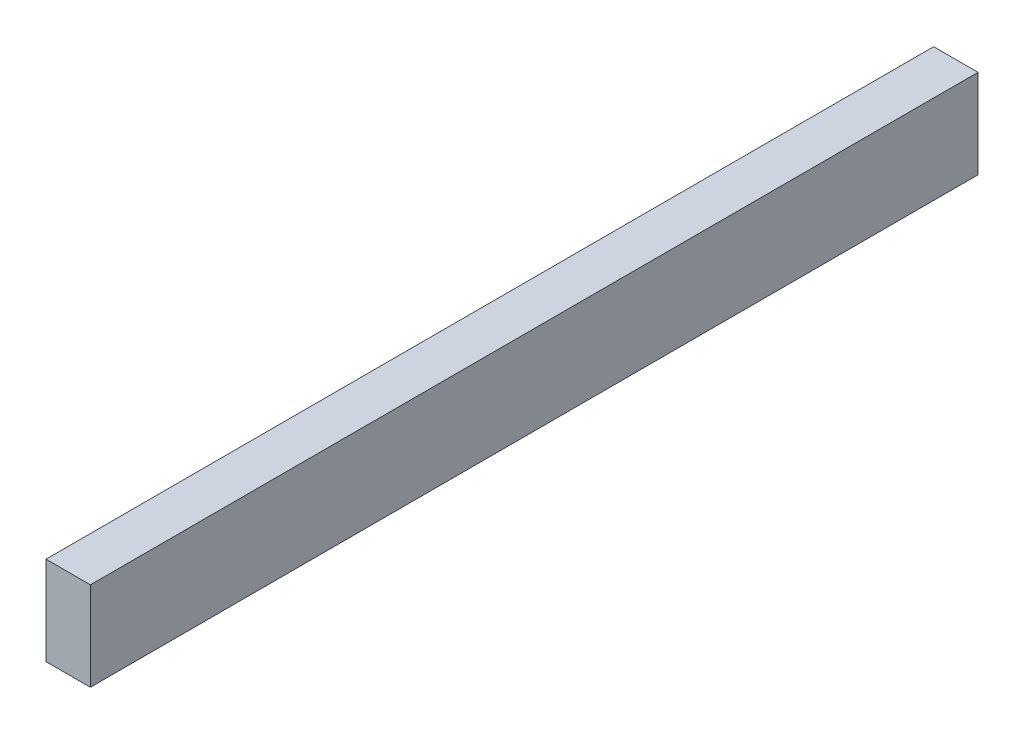
ISO-10303-21;
HEADER;
FILE_DESCRIPTION(('STEP AP214'),'2;1');
FILE_NAME('part.step','',(''),(''),'','','');
FILE_SCHEMA(('AUTOMOTIVE_DESIGN { 1 0 10303 214 1 1 1 1 }'));
ENDSEC;
DATA;
#1=APPLICATION_CONTEXT('core data for automotive mechanical design processes');
#2=APPLICATION_PROTOCOL_DEFINITION('international standard','automotive_design',2000,#1);
#3=PRODUCT_CONTEXT('',#1,'mechanical');
#4=PRODUCT('Part','Part','',(#3));
#5=PRODUCT_RELATED_PRODUCT_CATEGORY('part','',(#4));
#6=PRODUCT_DEFINITION_FORMATION('','',#4);
#7=PRODUCT_DEFINITION_CONTEXT('part definition',#1,'design');
#8=PRODUCT_DEFINITION('design','',#6,#7);
#9=PRODUCT_DEFINITION_SHAPE('','',#8);
#10=(LENGTH_UNIT() NAMED_UNIT(*) SI_UNIT(.MILLI.,.METRE.));
#11=(NAMED_UNIT(*) PLANE_ANGLE_UNIT() SI_UNIT($,.RADIAN.));
#12=(NAMED_UNIT(*) SI_UNIT($,.STERADIAN.) SOLID_ANGLE_UNIT());
#13=UNCERTAINTY_MEASURE_WITH_UNIT(LENGTH_MEASURE(1.E-05),#10,'distance_accuracy_value','');
#14=(GEOMETRIC_REPRESENTATION_CONTEXT(3) GLOBAL_UNCERTAINTY_ASSIGNED_CONTEXT((#13)) GLOBAL_UNIT_ASSIGNED_CONTEXT((#10,
#11,#12)) REPRESENTATION_CONTEXT('',''));
#15=CARTESIAN_POINT('',(0.,0.,0.));
#16=DIRECTION('',(0.,0.,1.));
#17=DIRECTION('',(1.,0.,0.));
#18=AXIS2_PLACEMENT_3D('',#15,#16,#17);
#19=CARTESIAN_POINT('',(-1.97385135135135,0.502499999999999,30.));
#20=DIRECTION('',(1.,0.,0.));
#21=DIRECTION('',(0.,1.,0.));
#22=AXIS2_PLACEMENT_3D('',#19,#20,#21);
#23=PLANE('',#22);
#24=DIRECTION('',(0.,-1.,0.));
#25=VECTOR('',#24,1.);
#26=CARTESIAN_POINT('',(-1.97385135135135,0.502499999999999,0.));
#27=LINE('',#26,#25);
#28=CARTESIAN_POINT('',(-1.97385135135135,0.502499999999999,0.));
#29=VERTEX_POINT('',#28);
#30=CARTESIAN_POINT('',(-1.97385135135135,-2.4975,0.));
#31=VERTEX_POINT('',#30);
#32=EDGE_CURVE('E96',#29,#31,#27,.T.);
#33=ORIENTED_EDGE('',*,*,#32,.T.);
#34=DIRECTION('',(0.,0.,-1.));
#35=VECTOR('',#34,1.);
#36=CARTESIAN_POINT('',(-1.97385135135135,-2.4975,30.));
#37=LINE('',#36,#35);
#38=CARTESIAN_POINT('',(-1.97385135135135,-2.4975,30.));
#39=VERTEX_POINT('',#38);
#40=EDGE_CURVE('E11',#39,#31,#37,.T.);
#41=ORIENTED_EDGE('',*,*,#40,.F.);
#42=DIRECTION('',(0.,-1.,0.));
#43=VECTOR('',#42,1.);
#44=CARTESIAN_POINT('',(-1.97385135135135,0.502499999999999,30.));
#45=LINE('',#44,#43);
#46=CARTESIAN_POINT('',(-1.97385135135135,0.502499999999999,30.));
#47=VERTEX_POINT('',#46);
#48=EDGE_CURVE('E84',#47,#39,#45,.T.);
#49=ORIENTED_EDGE('',*,*,#48,.F.);
#50=DIRECTION('',(0.,0.,-1.));
#51=VECTOR('',#50,1.);
#52=CARTESIAN_POINT('',(-1.97385135135135,0.502499999999999,30.));
#53=LINE('',#52,#51);
#54=EDGE_CURVE('E92',#47,#29,#53,.T.);
#55=ORIENTED_EDGE('',*,*,#54,.T.);
#56=EDGE_LOOP('',(#33,#41,#49,#55));
#57=FACE_BOUND('',#56,.T.);
#58=ADVANCED_FACE('F33',(#57),#23,.F.);
#59=CARTESIAN_POINT('',(-1.97385135135135,-2.4975,30.));
#60=DIRECTION('',(0.,1.,0.));
#61=DIRECTION('',(0.,0.,1.));
#62=AXIS2_PLACEMENT_3D('',#59,#60,#61);
#63=PLANE('',#62);
#64=DIRECTION('',(1.,0.,0.));
#65=VECTOR('',#64,1.);
#66=CARTESIAN_POINT('',(-1.97385135135135,-2.4975,0.));
#67=LINE('',#66,#65);
#68=CARTESIAN_POINT('',(-0.473851351351351,-2.4975,0.));
#69=VERTEX_POINT('',#68);
#70=EDGE_CURVE('E88',#31,#69,#67,.T.);
#71=ORIENTED_EDGE('',*,*,#70,.T.);
#72=DIRECTION('',(0.,0.,-1.));
#73=VECTOR('',#72,1.);
#74=CARTESIAN_POINT('',(-0.473851351351351,-2.4975,30.));
#75=LINE('',#74,#73);
#76=CARTESIAN_POINT('',(-0.473851351351351,-2.4975,30.));
#77=VERTEX_POINT('',#76);
#78=EDGE_CURVE('E41',#77,#69,#75,.T.);
#79=ORIENTED_EDGE('',*,*,#78,.F.);
#80=DIRECTION('',(1.,0.,0.));
#81=VECTOR('',#80,1.);
#82=CARTESIAN_POINT('',(-1.97385135135135,-2.4975,30.));
#83=LINE('',#82,#81);
#84=EDGE_CURVE('E79',#39,#77,#83,.T.);
#85=ORIENTED_EDGE('',*,*,#84,.F.);
#86=ORIENTED_EDGE('',*,*,#40,.T.);
#87=EDGE_LOOP('',(#71,#79,#85,#86));
#88=FACE_BOUND('',#87,.T.);
#89=ADVANCED_FACE('F87',(#88),#63,.F.);
#90=CARTESIAN_POINT('',(-0.473851351351351,0.502499999999999,30.));
#91=DIRECTION('',(-1.,0.,0.));
#92=DIRECTION('',(0.,-1.,0.));
#93=AXIS2_PLACEMENT_3D('',#90,#91,#92);
#94=PLANE('',#93);
#95=DIRECTION('',(0.,1.,0.));
#96=VECTOR('',#95,1.);
#97=CARTESIAN_POINT('',(-0.473851351351351,0.502499999999999,0.));
#98=LINE('',#97,#96);
#99=CARTESIAN_POINT('',(-0.473851351351351,0.502499999999999,0.));
#100=VERTEX_POINT('',#99);
#101=EDGE_CURVE('E66',#69,#100,#98,.T.);
#102=ORIENTED_EDGE('',*,*,#101,.T.);
#103=DIRECTION('',(0.,0.,-1.));
#104=VECTOR('',#103,1.);
#105=CARTESIAN_POINT('',(-0.473851351351351,0.502499999999999,30.));
#106=LINE('',#105,#104);
#107=CARTESIAN_POINT('',(-0.473851351351351,0.502499999999999,30.));
#108=VERTEX_POINT('',#107);
#109=EDGE_CURVE('E89',#108,#100,#106,.T.);
#110=ORIENTED_EDGE('',*,*,#109,.F.);
#111=DIRECTION('',(0.,1.,0.));
#112=VECTOR('',#111,1.);
#113=CARTESIAN_POINT('',(-0.473851351351351,0.502499999999999,30.));
#114=LINE('',#113,#112);
#115=EDGE_CURVE('E82',#77,#108,#114,.T.);
#116=ORIENTED_EDGE('',*,*,#115,.F.);
#117=ORIENTED_EDGE('',*,*,#78,.T.);
#118=EDGE_LOOP('',(#102,#110,#116,#117));
#119=FACE_BOUND('',#118,.T.);
#120=ADVANCED_FACE('F90',(#119),#94,.F.);
#121=CARTESIAN_POINT('',(-1.97385135135135,0.502499999999999,30.));
#122=DIRECTION('',(0.,-1.,0.));
#123=DIRECTION('',(0.,0.,-1.));
#124=AXIS2_PLACEMENT_3D('',#121,#122,#123);
#125=PLANE('',#124);
#126=DIRECTION('',(-1.,0.,0.));
#127=VECTOR('',#126,1.);
#128=CARTESIAN_POINT('',(-1.97385135135135,0.502499999999999,0.));
#129=LINE('',#128,#127);
#130=EDGE_CURVE('E72',#100,#29,#129,.T.);
#131=ORIENTED_EDGE('',*,*,#130,.T.);
#132=ORIENTED_EDGE('',*,*,#54,.F.);
#133=DIRECTION('',(-1.,0.,0.));
#134=VECTOR('',#133,1.);
#135=CARTESIAN_POINT('',(-1.97385135135135,0.502499999999999,30.));
#136=LINE('',#135,#134);
#137=EDGE_CURVE('E49',#108,#47,#136,.T.);
#138=ORIENTED_EDGE('',*,*,#137,.F.);
#139=ORIENTED_EDGE('',*,*,#109,.T.);
#140=EDGE_LOOP('',(#131,#132,#138,#139));
#141=FACE_BOUND('',#140,.T.);
#142=ADVANCED_FACE('F103',(#141),#125,.F.);
#143=CARTESIAN_POINT('',(0.,0.,30.));
#144=DIRECTION('',(0.,0.,1.));
#145=DIRECTION('',(1.,0.,0.));
#146=AXIS2_PLACEMENT_3D('',#143,#144,#145);
#147=PLANE('',#146);
#148=ORIENTED_EDGE('',*,*,#48,.T.);
#149=ORIENTED_EDGE('',*,*,#84,.T.);
#150=ORIENTED_EDGE('',*,*,#115,.T.);
#151=ORIENTED_EDGE('',*,*,#137,.T.);
#152=EDGE_LOOP('',(#148,#149,#150,#151));
#153=FACE_BOUND('',#152,.T.);
#154=ADVANCED_FACE('F80',(#153),#147,.T.);
#155=CARTESIAN_POINT('',(0.,0.,0.));
#156=DIRECTION('',(0.,0.,1.));
#157=DIRECTION('',(1.,0.,0.));
#158=AXIS2_PLACEMENT_3D('',#155,#156,#157);
#159=PLANE('',#158);
#160=ORIENTED_EDGE('',*,*,#32,.F.);
#161=ORIENTED_EDGE('',*,*,#130,.F.);
#162=ORIENTED_EDGE('',*,*,#101,.F.);
#163=ORIENTED_EDGE('',*,*,#70,.F.);
#164=EDGE_LOOP('',(#160,#161,#162,#163));
#165=FACE_BOUND('',#164,.T.);
#166=ADVANCED_FACE('F106',(#165),#159,.F.);
#167=CLOSED_SHELL('',(#58,#89,#120,#142,#154,#166));
#168=MANIFOLD_SOLID_BREP('B2',#167);
#169=ADVANCED_BREP_SHAPE_REPRESENTATION('',(#18,#168),#14);
#170=SHAPE_DEFINITION_REPRESENTATION(#9,#169);
ENDSEC;
END-ISO-10303-21;
